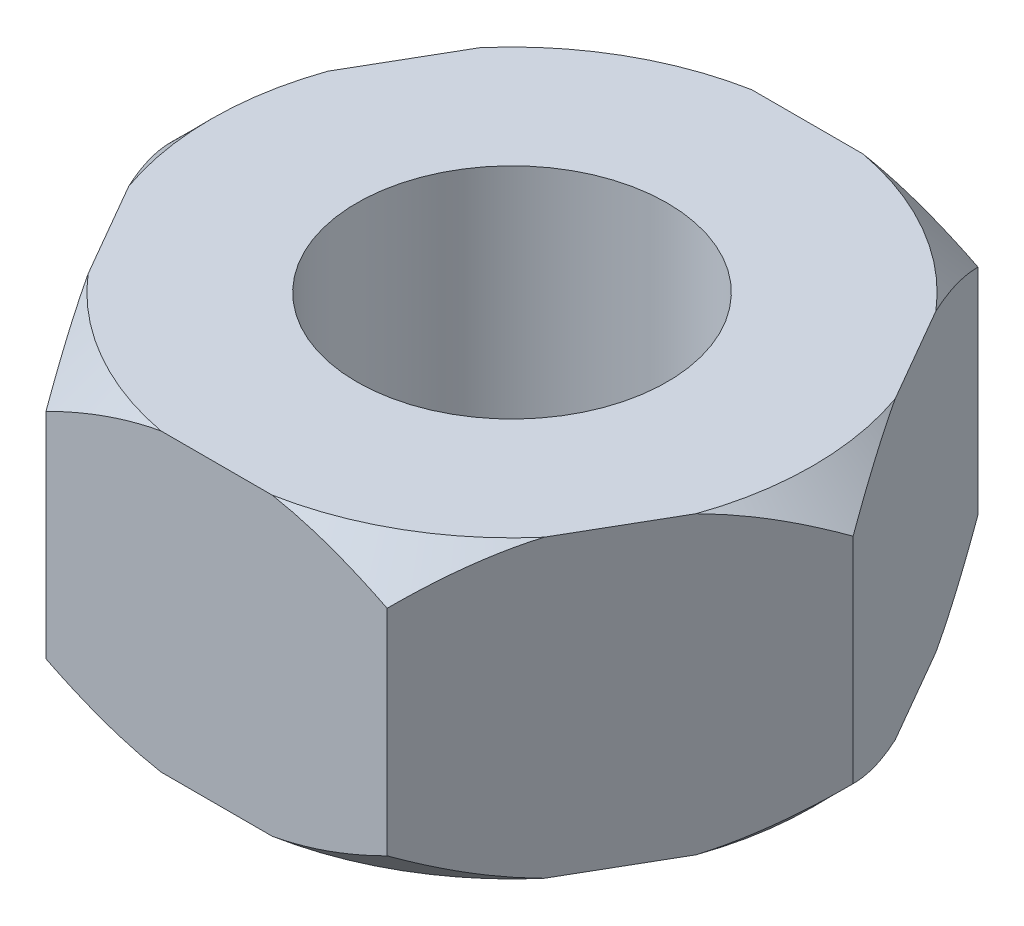
ISO-10303-21;
HEADER;
FILE_DESCRIPTION(('STEP AP214'),'2;1');
FILE_NAME('part.step','',(''),(''),'','','');
FILE_SCHEMA(('AUTOMOTIVE_DESIGN { 1 0 10303 214 1 1 1 1 }'));
ENDSEC;
DATA;
#1=APPLICATION_CONTEXT('core data for automotive mechanical design processes');
#2=APPLICATION_PROTOCOL_DEFINITION('international standard','automotive_design',2000,#1);
#3=PRODUCT_CONTEXT('',#1,'mechanical');
#4=PRODUCT('Part','Part','',(#3));
#5=PRODUCT_RELATED_PRODUCT_CATEGORY('part','',(#4));
#6=PRODUCT_DEFINITION_FORMATION('','',#4);
#7=PRODUCT_DEFINITION_CONTEXT('part definition',#1,'design');
#8=PRODUCT_DEFINITION('design','',#6,#7);
#9=PRODUCT_DEFINITION_SHAPE('','',#8);
#10=(LENGTH_UNIT() NAMED_UNIT(*) SI_UNIT(.MILLI.,.METRE.));
#11=(NAMED_UNIT(*) PLANE_ANGLE_UNIT() SI_UNIT($,.RADIAN.));
#12=(NAMED_UNIT(*) SI_UNIT($,.STERADIAN.) SOLID_ANGLE_UNIT());
#13=UNCERTAINTY_MEASURE_WITH_UNIT(LENGTH_MEASURE(1.E-05),#10,'distance_accuracy_value','');
#14=(GEOMETRIC_REPRESENTATION_CONTEXT(3) GLOBAL_UNCERTAINTY_ASSIGNED_CONTEXT((#13)) GLOBAL_UNIT_ASSIGNED_CONTEXT((#10,
#11,#12)) REPRESENTATION_CONTEXT('',''));
#15=CARTESIAN_POINT('',(0.,0.,0.));
#16=DIRECTION('',(0.,0.,1.));
#17=DIRECTION('',(1.,0.,0.));
#18=AXIS2_PLACEMENT_3D('',#15,#16,#17);
#19=CARTESIAN_POINT('',(-155.5659055475,-40.28,75.54261218576));
#20=DIRECTION('',(-0.866025403787037,0.,-0.4999999999955));
#21=DIRECTION('',(-0.4999999999955,0.,0.866025403787037));
#22=AXIS2_PLACEMENT_3D('',#19,#20,#21);
#23=PLANE('',#22);
#24=CARTESIAN_POINT('',(-157.921494645761,-36.7485356387702,79.6226121857378));
#25=CARTESIAN_POINT('',(-157.859691974781,-36.6867723869212,79.515566819565));
#26=CARTESIAN_POINT('',(-157.79712107854,-36.6278860064592,79.4071908482028));
#27=CARTESIAN_POINT('',(-157.670684653751,-36.5177944602112,79.1881965365405));
#28=CARTESIAN_POINT('',(-157.606826960013,-36.4665531121053,79.0775917665309));
#29=CARTESIAN_POINT('',(-157.477387724859,-36.372993690136,78.8533964347482));
#30=CARTESIAN_POINT('',(-157.411804456875,-36.33068496799,78.739802882472));
#31=CARTESIAN_POINT('',(-157.278814750935,-36.2567398375552,78.5094579548984));
#32=CARTESIAN_POINT('',(-157.211400928317,-36.2251569819203,78.3926937889897));
#33=CARTESIAN_POINT('',(-157.143314193647,-36.2000000000429,78.2747641052188));
#34=B_SPLINE_CURVE_WITH_KNOTS('',3,(#24,#25,#26,#27,#28,#29,#30,#31,#32,#33),.UNSPECIFIED.,.F.,
.F.,(4,2,2,2,4),(0.,0.414622566750982,0.827215920648911,1.2402391067894,1.65529513906042),.UNSPECIFIED.);
#35=CARTESIAN_POINT('',(-157.921494645754,-36.7485356387734,79.6226121857601));
#36=VERTEX_POINT('',#35);
#37=CARTESIAN_POINT('',(-157.143314193585,-36.20000000002,78.2747641051114));
#38=VERTEX_POINT('',#37);
#39=EDGE_CURVE('E152',#36,#38,#34,.T.);
#40=ORIENTED_EDGE('',*,*,#39,.T.);
#41=DIRECTION('',(0.4999999999955,0.,-0.866025403787037));
#42=VECTOR('',#41,1.);
#43=CARTESIAN_POINT('',(-156.7667941074,-36.2,77.62261218576));
#44=LINE('',#43,#42);
#45=CARTESIAN_POINT('',(-156.390274021262,-36.1999999999984,76.9704602664914));
#46=VERTEX_POINT('',#45);
#47=EDGE_CURVE('E145',#38,#46,#44,.T.);
#48=ORIENTED_EDGE('',*,*,#47,.T.);
#49=CARTESIAN_POINT('',(-156.390274021148,-36.2000000000406,76.9704602662901));
#50=CARTESIAN_POINT('',(-156.322187286478,-36.2251569819179,76.8525305825204));
#51=CARTESIAN_POINT('',(-156.254773463859,-36.2567398375526,76.7357664166124));
#52=CARTESIAN_POINT('',(-156.12178375792,-36.3306849679866,76.5054214890399));
#53=CARTESIAN_POINT('',(-156.056200489936,-36.3729936901321,76.3918279367641));
#54=CARTESIAN_POINT('',(-155.926761254783,-36.4665531121002,76.1676326049823));
#55=CARTESIAN_POINT('',(-155.862903561045,-36.5177944602055,76.0570278349732));
#56=CARTESIAN_POINT('',(-155.736467136257,-36.6278860064531,75.8380335233113));
#57=CARTESIAN_POINT('',(-155.673896240018,-36.6867723869155,75.7296575519488));
#58=CARTESIAN_POINT('',(-155.612093569043,-36.748535638766,75.6226121857749));
#59=B_SPLINE_CURVE_WITH_KNOTS('',3,(#49,#50,#51,#52,#53,#54,#55,#56,#57,#58),.UNSPECIFIED.,.F.,
.F.,(4,2,2,2,4),(0.,0.415056032269073,0.828079218407549,1.24067257230367,1.65529513905292),.UNSPECIFIED.);
#60=CARTESIAN_POINT('',(-155.612093569036,-36.7485356387688,75.6226121857677));
#61=VERTEX_POINT('',#60);
#62=EDGE_CURVE('E21',#46,#61,#59,.T.);
#63=ORIENTED_EDGE('',*,*,#62,.T.);
#64=DIRECTION('',(0.,1.,0.));
#65=VECTOR('',#64,1.);
#66=CARTESIAN_POINT('',(-155.612093569029,-38.2,75.62261218576));
#67=LINE('',#66,#65);
#68=CARTESIAN_POINT('',(-155.612093569028,-39.6514643612353,75.6226121857677));
#69=VERTEX_POINT('',#68);
#70=EDGE_CURVE('E232',#69,#61,#67,.T.);
#71=ORIENTED_EDGE('',*,*,#70,.F.);
#72=CARTESIAN_POINT('',(-155.612093569047,-39.6514643612363,75.6226121857725));
#73=CARTESIAN_POINT('',(-155.67389624002,-39.7132276130856,75.7296575519483));
#74=CARTESIAN_POINT('',(-155.736467136258,-39.7721139935474,75.8380335233115));
#75=CARTESIAN_POINT('',(-155.862903561045,-39.8822055397945,76.0570278349739));
#76=CARTESIAN_POINT('',(-155.926761254783,-39.9334468878998,76.1676326049827));
#77=CARTESIAN_POINT('',(-156.056200489937,-40.027006309868,76.3918279367642));
#78=CARTESIAN_POINT('',(-156.12178375792,-40.0693150320135,76.5054214890399));
#79=CARTESIAN_POINT('',(-156.254773463859,-40.1432601624474,76.7357664166126));
#80=CARTESIAN_POINT('',(-156.322187286477,-40.1748430180818,76.852530582521));
#81=CARTESIAN_POINT('',(-156.390274021146,-40.1999999999588,76.9704602662912));
#82=B_SPLINE_CURVE_WITH_KNOTS('',3,(#72,#73,#74,#75,#76,#77,#78,#79,#80,#81),.UNSPECIFIED.,.F.,
.F.,(4,2,2,2,4),(0.,0.414622566748969,0.827215920644832,1.24023910678314,1.6552951390521),.UNSPECIFIED.);
#83=CARTESIAN_POINT('',(-156.390274021206,-40.1999999999809,76.9704602663947));
#84=VERTEX_POINT('',#83);
#85=EDGE_CURVE('E171',#69,#84,#82,.T.);
#86=ORIENTED_EDGE('',*,*,#85,.T.);
#87=DIRECTION('',(-0.499999999995498,0.,0.866025403787038));
#88=VECTOR('',#87,1.);
#89=CARTESIAN_POINT('',(-156.7667941074,-40.2,77.62261218576));
#90=LINE('',#89,#88);
#91=CARTESIAN_POINT('',(-157.143314193527,-40.2000000000015,78.2747641050108));
#92=VERTEX_POINT('',#91);
#93=EDGE_CURVE('E172',#84,#92,#90,.T.);
#94=ORIENTED_EDGE('',*,*,#93,.T.);
#95=CARTESIAN_POINT('',(-157.143314193652,-40.1999999999591,78.2747641052172));
#96=CARTESIAN_POINT('',(-157.211400928319,-40.1748430180804,78.3926937889893));
#97=CARTESIAN_POINT('',(-157.278814750936,-40.1432601624449,78.5094579548987));
#98=CARTESIAN_POINT('',(-157.411804456875,-40.0693150320096,78.7398028824726));
#99=CARTESIAN_POINT('',(-157.477387724859,-40.0270063098637,78.8533964347487));
#100=CARTESIAN_POINT('',(-157.606826960014,-39.9334468878947,79.0775917665312));
#101=CARTESIAN_POINT('',(-157.670684653751,-39.8822055397889,79.1881965365407));
#102=CARTESIAN_POINT('',(-157.797121078539,-39.7721139935402,79.4071908482036));
#103=CARTESIAN_POINT('',(-157.859691974779,-39.7132276130772,79.5155668195664));
#104=CARTESIAN_POINT('',(-157.921494645755,-39.6514643612262,79.6226121857407));
#105=B_SPLINE_CURVE_WITH_KNOTS('',3,(#95,#96,#97,#98,#99,#100,#101,#102,#103,#104),
.UNSPECIFIED.,.F.,.F.,(4,2,2,2,4),(0.,0.415056032270949,0.828079218411311,1.24067257230941,
1.65529513906064),.UNSPECIFIED.);
#106=CARTESIAN_POINT('',(-157.92149464576,-39.6514643612208,79.6226121857499));
#107=VERTEX_POINT('',#106);
#108=EDGE_CURVE('E175',#92,#107,#105,.T.);
#109=ORIENTED_EDGE('',*,*,#108,.T.);
#110=DIRECTION('',(0.,-1.,0.));
#111=VECTOR('',#110,1.);
#112=CARTESIAN_POINT('',(-157.921494645766,-38.2,79.62261218576));
#113=LINE('',#112,#111);
#114=EDGE_CURVE('E434',#36,#107,#113,.T.);
#115=ORIENTED_EDGE('',*,*,#114,.F.);
#116=EDGE_LOOP('',(#40,#48,#63,#71,#86,#94,#109,#115));
#117=FACE_BOUND('',#116,.T.);
#118=ADVANCED_FACE('F17',(#117),#23,.T.);
#119=CARTESIAN_POINT('',(-157.9676826673,-40.28,79.54261218576));
#120=DIRECTION('',(-0.866025403787038,0.,0.499999999995498));
#121=DIRECTION('',(0.499999999995498,0.,0.866025403787038));
#122=AXIS2_PLACEMENT_3D('',#119,#120,#121);
#123=PLANE('',#122);
#124=CARTESIAN_POINT('',(-155.61209356904,-36.7485356387683,83.6226121857475));
#125=CARTESIAN_POINT('',(-155.673896240017,-36.6867723869172,83.5155668195737));
#126=CARTESIAN_POINT('',(-155.736467136256,-36.6278860064544,83.4071908482112));
#127=CARTESIAN_POINT('',(-155.862903561044,-36.5177944602064,83.1881965365488));
#128=CARTESIAN_POINT('',(-155.926761254782,-36.466553112101,83.0775917665394));
#129=CARTESIAN_POINT('',(-156.056200489936,-36.3729936901326,82.8533964347571));
#130=CARTESIAN_POINT('',(-156.12178375792,-36.3306849679869,82.7398028824811));
#131=CARTESIAN_POINT('',(-156.254773463859,-36.2567398375527,82.5094579549078));
#132=CARTESIAN_POINT('',(-156.322187286477,-36.2251569819181,82.3926937889992));
#133=CARTESIAN_POINT('',(-156.390274021147,-36.2000000000412,82.2747641052286));
#134=B_SPLINE_CURVE_WITH_KNOTS('',3,(#124,#125,#126,#127,#128,#129,#130,#131,#132,#133),
.UNSPECIFIED.,.F.,.F.,(4,2,2,2,4),(0.,0.414622566750397,0.82721592064761,1.24023910678717,
1.6552951390574),.UNSPECIFIED.);
#135=CARTESIAN_POINT('',(-155.612093569035,-36.7485356387698,83.6226121857541));
#136=VERTEX_POINT('',#135);
#137=CARTESIAN_POINT('',(-156.390274021206,-36.2000000000191,82.2747641051251));
#138=VERTEX_POINT('',#137);
#139=EDGE_CURVE('E429',#136,#138,#134,.T.);
#140=ORIENTED_EDGE('',*,*,#139,.T.);
#141=DIRECTION('',(-0.499999999995498,0.,-0.866025403787038));
#142=VECTOR('',#141,1.);
#143=CARTESIAN_POINT('',(-156.7667941074,-36.2,81.62261218576));
#144=LINE('',#143,#142);
#145=CARTESIAN_POINT('',(-157.143314193527,-36.1999999999984,80.9704602665093));
#146=VERTEX_POINT('',#145);
#147=EDGE_CURVE('E427',#138,#146,#144,.T.);
#148=ORIENTED_EDGE('',*,*,#147,.T.);
#149=CARTESIAN_POINT('',(-157.143314193652,-36.2000000000408,80.9704602663033));
#150=CARTESIAN_POINT('',(-157.211400928319,-36.2251569819194,80.852530582531));
#151=CARTESIAN_POINT('',(-157.278814750936,-36.2567398375549,80.7357664166217));
#152=CARTESIAN_POINT('',(-157.411804456875,-36.3306849679902,80.5054214890476));
#153=CARTESIAN_POINT('',(-157.477387724859,-36.3729936901362,80.3918279367715));
#154=CARTESIAN_POINT('',(-157.606826960014,-36.4665531121052,80.167632604989));
#155=CARTESIAN_POINT('',(-157.670684653751,-36.517794460211,80.0570278349794));
#156=CARTESIAN_POINT('',(-157.797121078539,-36.6278860064598,79.8380335233165));
#157=CARTESIAN_POINT('',(-157.859691974779,-36.6867723869227,79.7296575519536));
#158=CARTESIAN_POINT('',(-157.921494645755,-36.7485356387738,79.6226121857793));
#159=B_SPLINE_CURVE_WITH_KNOTS('',3,(#149,#150,#151,#152,#153,#154,#155,#156,#157,#158),
.UNSPECIFIED.,.F.,.F.,(4,2,2,2,4),(0.,0.415056032271064,0.828079218411548,1.24067257230975,
1.65529513906108),.UNSPECIFIED.);
#160=EDGE_CURVE('E156',#146,#36,#159,.T.);
#161=ORIENTED_EDGE('',*,*,#160,.T.);
#162=ORIENTED_EDGE('',*,*,#114,.T.);
#163=CARTESIAN_POINT('',(-157.921494645761,-39.65146436123,79.6226121857825));
#164=CARTESIAN_POINT('',(-157.859691974781,-39.713227613079,79.7296575519553));
#165=CARTESIAN_POINT('',(-157.79712107854,-39.772113993541,79.8380335233175));
#166=CARTESIAN_POINT('',(-157.67068465375,-39.8822055397889,80.0570278349798));
#167=CARTESIAN_POINT('',(-157.606826960013,-39.9334468878949,80.1676326049894));
#168=CARTESIAN_POINT('',(-157.477387724859,-40.0270063098641,80.3918279367721));
#169=CARTESIAN_POINT('',(-157.411804456875,-40.0693150320102,80.5054214890483));
#170=CARTESIAN_POINT('',(-157.278814750935,-40.1432601624449,80.7357664166219));
#171=CARTESIAN_POINT('',(-157.211400928317,-40.1748430180798,80.8525305825307));
#172=CARTESIAN_POINT('',(-157.143314193647,-40.1999999999572,80.9704602663016));
#173=B_SPLINE_CURVE_WITH_KNOTS('',3,(#163,#164,#165,#166,#167,#168,#169,#170,#171,#172),
.UNSPECIFIED.,.F.,.F.,(4,2,2,2,4),(0.,0.414622566751001,0.827215920648933,1.24023910678942,
1.65529513906044),.UNSPECIFIED.);
#174=CARTESIAN_POINT('',(-157.143314193585,-40.1999999999801,80.9704602664087));
#175=VERTEX_POINT('',#174);
#176=EDGE_CURVE('E433',#107,#175,#173,.T.);
#177=ORIENTED_EDGE('',*,*,#176,.T.);
#178=DIRECTION('',(0.499999999995498,0.,0.866025403787038));
#179=VECTOR('',#178,1.);
#180=CARTESIAN_POINT('',(-156.7667941074,-40.2,81.62261218576));
#181=LINE('',#180,#179);
#182=CARTESIAN_POINT('',(-156.390274021262,-40.2000000000015,82.2747641050287));
#183=VERTEX_POINT('',#182);
#184=EDGE_CURVE('E430',#175,#183,#181,.T.);
#185=ORIENTED_EDGE('',*,*,#184,.T.);
#186=CARTESIAN_POINT('',(-156.390274021148,-40.1999999999595,82.2747641052297));
#187=CARTESIAN_POINT('',(-156.322187286478,-40.1748430180822,82.3926937889994));
#188=CARTESIAN_POINT('',(-156.254773463859,-40.1432601624475,82.5094579549075));
#189=CARTESIAN_POINT('',(-156.12178375792,-40.0693150320134,82.73980288248));
#190=CARTESIAN_POINT('',(-156.056200489936,-40.0270063098679,82.8533964347559));
#191=CARTESIAN_POINT('',(-155.926761254783,-39.9334468878998,83.0775917665377));
#192=CARTESIAN_POINT('',(-155.862903561045,-39.8822055397946,83.1881965365467));
#193=CARTESIAN_POINT('',(-155.736467136257,-39.7721139935469,83.4071908482087));
#194=CARTESIAN_POINT('',(-155.673896240018,-39.7132276130845,83.5155668195711));
#195=CARTESIAN_POINT('',(-155.612093569043,-39.6514643612339,83.6226121857451));
#196=B_SPLINE_CURVE_WITH_KNOTS('',3,(#186,#187,#188,#189,#190,#191,#192,#193,#194,#195),
.UNSPECIFIED.,.F.,.F.,(4,2,2,2,4),(0.,0.415056032269142,0.828079218407667,1.24067257230384,
1.65529513905314),.UNSPECIFIED.);
#197=CARTESIAN_POINT('',(-155.612093569036,-39.6514643612312,83.6226121857523));
#198=VERTEX_POINT('',#197);
#199=EDGE_CURVE('E432',#183,#198,#196,.T.);
#200=ORIENTED_EDGE('',*,*,#199,.T.);
#201=DIRECTION('',(0.,-1.,0.));
#202=VECTOR('',#201,1.);
#203=CARTESIAN_POINT('',(-155.612093569029,-38.2,83.62261218576));
#204=LINE('',#203,#202);
#205=EDGE_CURVE('E421',#136,#198,#204,.T.);
#206=ORIENTED_EDGE('',*,*,#205,.F.);
#207=EDGE_LOOP('',(#140,#148,#161,#162,#177,#185,#200,#206));
#208=FACE_BOUND('',#207,.T.);
#209=ADVANCED_FACE('F194',(#208),#123,.T.);
#210=CARTESIAN_POINT('',(-150.9009153724,-40.28,75.62261218576));
#211=DIRECTION('',(0.,0.,-1.));
#212=DIRECTION('',(-1.,0.,0.));
#213=AXIS2_PLACEMENT_3D('',#210,#211,#212);
#214=PLANE('',#213);
#215=CARTESIAN_POINT('',(-155.612093569014,-36.7485356387613,75.6226121857543));
#216=CARTESIAN_POINT('',(-155.488488227059,-36.6867723869088,75.6226121857579));
#217=CARTESIAN_POINT('',(-155.363346434578,-36.6278860064436,75.6226121857594));
#218=CARTESIAN_POINT('',(-155.110473584996,-36.5177944601895,75.6226121857605));
#219=CARTESIAN_POINT('',(-154.982758197517,-36.4665531120806,75.6226121857601));
#220=CARTESIAN_POINT('',(-154.723879727203,-36.3729936901056,75.6226121857598));
#221=CARTESIAN_POINT('',(-154.592713191231,-36.3306849679567,75.6226121857599));
#222=CARTESIAN_POINT('',(-154.326733779345,-36.2567398375164,75.6226121857601));
#223=CARTESIAN_POINT('',(-154.191906134105,-36.2251569818789,75.6226121857601));
#224=CARTESIAN_POINT('',(-154.055732664762,-36.1999999999991,75.62261218576));
#225=B_SPLINE_CURVE_WITH_KNOTS('',3,(#215,#216,#217,#218,#219,#220,#221,#222,#223,#224),
.UNSPECIFIED.,.F.,.F.,(4,2,2,2,4),(0.,0.414622566759554,0.827215920665987,1.24023910681503,
1.65529513909453),.UNSPECIFIED.);
#226=CARTESIAN_POINT('',(-154.055732664756,-36.199999999998,75.62261218576));
#227=VERTEX_POINT('',#226);
#228=EDGE_CURVE('E170',#61,#227,#225,.T.);
#229=ORIENTED_EDGE('',*,*,#228,.T.);
#230=DIRECTION('',(1.,0.,0.));
#231=VECTOR('',#230,1.);
#232=CARTESIAN_POINT('',(-153.30269249225,-36.2,75.62261218576));
#233=LINE('',#232,#231);
#234=CARTESIAN_POINT('',(-152.549652319642,-36.1999999999984,75.62261218576));
#235=VERTEX_POINT('',#234);
#236=EDGE_CURVE('E163',#227,#235,#233,.T.);
#237=ORIENTED_EDGE('',*,*,#236,.T.);
#238=CARTESIAN_POINT('',(-152.549652319716,-36.1999999999848,75.62261218576));
#239=CARTESIAN_POINT('',(-152.413478850373,-36.2251569818619,75.62261218576));
#240=CARTESIAN_POINT('',(-152.278651205133,-36.256739837497,75.62261218576));
#241=CARTESIAN_POINT('',(-152.012671793247,-36.3306849679327,75.62261218576));
#242=CARTESIAN_POINT('',(-151.881505257275,-36.3729936900795,75.62261218576));
#243=CARTESIAN_POINT('',(-151.622626786961,-36.4665531120505,75.62261218576));
#244=CARTESIAN_POINT('',(-151.494911399482,-36.5177944601573,75.62261218576));
#245=CARTESIAN_POINT('',(-151.2420385499,-36.6278860064084,75.62261218576));
#246=CARTESIAN_POINT('',(-151.116896757418,-36.6867723868727,75.62261218576));
#247=CARTESIAN_POINT('',(-150.993291415464,-36.7485356387253,75.62261218576));
#248=B_SPLINE_CURVE_WITH_KNOTS('',3,(#238,#239,#240,#241,#242,#243,#244,#245,#246,#247),
.UNSPECIFIED.,.F.,.F.,(4,2,2,2,4),(0.,0.415056032277929,0.828079218425136,1.24067257232983,
1.65529513908789),.UNSPECIFIED.);
#249=CARTESIAN_POINT('',(-150.993291415465,-36.748535638725,75.6226121857599));
#250=VERTEX_POINT('',#249);
#251=EDGE_CURVE('E261',#235,#250,#248,.T.);
#252=ORIENTED_EDGE('',*,*,#251,.T.);
#253=DIRECTION('',(0.,1.,0.));
#254=VECTOR('',#253,1.);
#255=CARTESIAN_POINT('',(-150.993291415466,-38.2,75.6226121857597));
#256=LINE('',#255,#254);
#257=CARTESIAN_POINT('',(-150.993291415467,-39.6514643612752,75.6226121857592));
#258=VERTEX_POINT('',#257);
#259=EDGE_CURVE('E281',#258,#250,#256,.T.);
#260=ORIENTED_EDGE('',*,*,#259,.F.);
#261=CARTESIAN_POINT('',(-150.993291415467,-39.6514643612759,75.62261218576));
#262=CARTESIAN_POINT('',(-151.11689675742,-39.7132276131284,75.62261218576));
#263=CARTESIAN_POINT('',(-151.242038549902,-39.7721139935925,75.62261218576));
#264=CARTESIAN_POINT('',(-151.494911399483,-39.8822055398434,75.62261218576));
#265=CARTESIAN_POINT('',(-151.622626786962,-39.9334468879501,75.62261218576));
#266=CARTESIAN_POINT('',(-151.881505257277,-40.0270063099208,75.62261218576));
#267=CARTESIAN_POINT('',(-152.012671793248,-40.0693150320675,75.62261218576));
#268=CARTESIAN_POINT('',(-152.278651205133,-40.1432601625031,75.62261218576));
#269=CARTESIAN_POINT('',(-152.413478850373,-40.1748430181382,75.62261218576));
#270=CARTESIAN_POINT('',(-152.549652319716,-40.2000000000153,75.62261218576));
#271=B_SPLINE_CURVE_WITH_KNOTS('',3,(#261,#262,#263,#264,#265,#266,#267,#268,#269,#270),
.UNSPECIFIED.,.F.,.F.,(4,2,2,2,4),(0.,0.414622566757387,0.827215920661415,1.24023910680793,
1.65529513908515),.UNSPECIFIED.);
#272=CARTESIAN_POINT('',(-152.549652319683,-40.2000000000092,75.62261218576));
#273=VERTEX_POINT('',#272);
#274=EDGE_CURVE('E256',#258,#273,#271,.T.);
#275=ORIENTED_EDGE('',*,*,#274,.T.);
#276=DIRECTION('',(-1.,0.,0.));
#277=VECTOR('',#276,1.);
#278=CARTESIAN_POINT('',(-153.30269249225,-40.2,75.62261218576));
#279=LINE('',#278,#277);
#280=CARTESIAN_POINT('',(-154.055732664758,-40.2000000000015,75.62261218576));
#281=VERTEX_POINT('',#280);
#282=EDGE_CURVE('E260',#273,#281,#279,.T.);
#283=ORIENTED_EDGE('',*,*,#282,.T.);
#284=CARTESIAN_POINT('',(-154.055732664762,-40.2000000000009,75.62261218576));
#285=CARTESIAN_POINT('',(-154.191906134105,-40.1748430181213,75.62261218576));
#286=CARTESIAN_POINT('',(-154.326733779345,-40.1432601624837,75.62261218576));
#287=CARTESIAN_POINT('',(-154.592713191231,-40.0693150320433,75.62261218576));
#288=CARTESIAN_POINT('',(-154.723879727202,-40.0270063098944,75.62261218576));
#289=CARTESIAN_POINT('',(-154.982758197517,-39.9334468879194,75.62261218576));
#290=CARTESIAN_POINT('',(-155.110473584996,-39.8822055398106,75.62261218576));
#291=CARTESIAN_POINT('',(-155.363346434578,-39.772113993556,75.62261218576));
#292=CARTESIAN_POINT('',(-155.488488227059,-39.7132276130901,75.62261218576));
#293=CARTESIAN_POINT('',(-155.612093569013,-39.6514643612359,75.62261218576));
#294=B_SPLINE_CURVE_WITH_KNOTS('',3,(#284,#285,#286,#287,#288,#289,#290,#291,#292,#293),
.UNSPECIFIED.,.F.,.F.,(4,2,2,2,4),(0.,0.415056032279846,0.828079218429034,1.24067257233574,
1.65529513909573),.UNSPECIFIED.);
#295=EDGE_CURVE('E240',#281,#69,#294,.T.);
#296=ORIENTED_EDGE('',*,*,#295,.T.);
#297=ORIENTED_EDGE('',*,*,#70,.T.);
#298=EDGE_LOOP('',(#229,#237,#252,#260,#275,#283,#296,#297));
#299=FACE_BOUND('',#298,.T.);
#300=ADVANCED_FACE('F245',(#299),#214,.T.);
#301=CARTESIAN_POINT('',(-155.7044696121,-40.28,83.62261218576));
#302=DIRECTION('',(0.,0.,1.));
#303=DIRECTION('',(1.,0.,0.));
#304=AXIS2_PLACEMENT_3D('',#301,#302,#303);
#305=PLANE('',#304);
#306=CARTESIAN_POINT('',(-150.993291415463,-36.7485356387259,83.62261218576));
#307=CARTESIAN_POINT('',(-151.116896757416,-36.6867723868735,83.62261218576));
#308=CARTESIAN_POINT('',(-151.242038549897,-36.6278860064095,83.62261218576));
#309=CARTESIAN_POINT('',(-151.494911399478,-36.5177944601587,83.62261218576));
#310=CARTESIAN_POINT('',(-151.622626786956,-36.4665531120521,83.62261218576));
#311=CARTESIAN_POINT('',(-151.88150525727,-36.3729936900814,83.62261218576));
#312=CARTESIAN_POINT('',(-152.012671793241,-36.3306849679347,83.62261218576));
#313=CARTESIAN_POINT('',(-152.278651205125,-36.2567398374988,83.62261218576));
#314=CARTESIAN_POINT('',(-152.413478850365,-36.2251569818637,83.62261218576));
#315=CARTESIAN_POINT('',(-152.549652319707,-36.1999999999864,83.62261218576));
#316=B_SPLINE_CURVE_WITH_KNOTS('',3,(#306,#307,#308,#309,#310,#311,#312,#313,#314,#315),
.UNSPECIFIED.,.F.,.F.,(4,2,2,2,4),(0.,0.414622566756066,0.827215920658808,1.24023910680401,
1.65529513907994),.UNSPECIFIED.);
#317=CARTESIAN_POINT('',(-150.993291415463,-36.7485356387248,83.6226121857592));
#318=VERTEX_POINT('',#317);
#319=CARTESIAN_POINT('',(-152.54965231967,-36.1999999999932,83.62261218576));
#320=VERTEX_POINT('',#319);
#321=EDGE_CURVE('E314',#318,#320,#316,.T.);
#322=ORIENTED_EDGE('',*,*,#321,.T.);
#323=DIRECTION('',(-1.,0.,0.));
#324=VECTOR('',#323,1.);
#325=CARTESIAN_POINT('',(-153.30269249225,-36.2,83.62261218576));
#326=LINE('',#325,#324);
#327=CARTESIAN_POINT('',(-154.055732664758,-36.1999999999984,83.62261218576));
#328=VERTEX_POINT('',#327);
#329=EDGE_CURVE('E364',#320,#328,#326,.T.);
#330=ORIENTED_EDGE('',*,*,#329,.T.);
#331=CARTESIAN_POINT('',(-154.055732664752,-36.1999999999972,83.62261218576));
#332=CARTESIAN_POINT('',(-154.191906134094,-36.2251569818765,83.62261218576));
#333=CARTESIAN_POINT('',(-154.326733779335,-36.2567398375137,83.62261218576));
#334=CARTESIAN_POINT('',(-154.59271319122,-36.3306849679533,83.62261218576));
#335=CARTESIAN_POINT('',(-154.723879727191,-36.3729936901019,83.62261218576));
#336=CARTESIAN_POINT('',(-154.982758197506,-36.4665531120761,83.62261218576));
#337=CARTESIAN_POINT('',(-155.110473584984,-36.5177944601845,83.62261218576));
#338=CARTESIAN_POINT('',(-155.363346434566,-36.6278860064384,83.62261218576));
#339=CARTESIAN_POINT('',(-155.488488227047,-36.6867723869041,83.62261218576));
#340=CARTESIAN_POINT('',(-155.612093569001,-36.7485356387579,83.62261218576));
#341=B_SPLINE_CURVE_WITH_KNOTS('',3,(#331,#332,#333,#334,#335,#336,#337,#338,#339,#340),
.UNSPECIFIED.,.F.,.F.,(4,2,2,2,4),(0.,0.415056032278941,0.82807921842715,1.24067257233291,
1.65529513909197),.UNSPECIFIED.);
#342=EDGE_CURVE('E308',#328,#136,#341,.T.);
#343=ORIENTED_EDGE('',*,*,#342,.T.);
#344=ORIENTED_EDGE('',*,*,#205,.T.);
#345=CARTESIAN_POINT('',(-155.612093569014,-39.651464361239,83.6226121857658));
#346=CARTESIAN_POINT('',(-155.488488227059,-39.7132276130913,83.6226121857621));
#347=CARTESIAN_POINT('',(-155.363346434578,-39.7721139935565,83.6226121857605));
#348=CARTESIAN_POINT('',(-155.110473584996,-39.8822055398105,83.6226121857594));
#349=CARTESIAN_POINT('',(-154.982758197517,-39.9334468879194,83.6226121857598));
#350=CARTESIAN_POINT('',(-154.723879727203,-40.0270063098944,83.6226121857602));
#351=CARTESIAN_POINT('',(-154.592713191231,-40.0693150320433,83.6226121857601));
#352=CARTESIAN_POINT('',(-154.326733779345,-40.1432601624836,83.6226121857599));
#353=CARTESIAN_POINT('',(-154.191906134105,-40.1748430181211,83.6226121857598));
#354=CARTESIAN_POINT('',(-154.055732664762,-40.2000000000008,83.62261218576));
#355=B_SPLINE_CURVE_WITH_KNOTS('',3,(#345,#346,#347,#348,#349,#350,#351,#352,#353,#354),
.UNSPECIFIED.,.F.,.F.,(4,2,2,2,4),(0.,0.414622566759535,0.827215920665909,1.2402391068149,
1.65529513909441),.UNSPECIFIED.);
#356=CARTESIAN_POINT('',(-154.055732664756,-40.2000000000019,83.62261218576));
#357=VERTEX_POINT('',#356);
#358=EDGE_CURVE('E233',#198,#357,#355,.T.);
#359=ORIENTED_EDGE('',*,*,#358,.T.);
#360=DIRECTION('',(1.,0.,0.));
#361=VECTOR('',#360,1.);
#362=CARTESIAN_POINT('',(-153.30269249225,-40.2,83.62261218576));
#363=LINE('',#362,#361);
#364=CARTESIAN_POINT('',(-152.549652319642,-40.2000000000015,83.62261218576));
#365=VERTEX_POINT('',#364);
#366=EDGE_CURVE('E354',#357,#365,#363,.T.);
#367=ORIENTED_EDGE('',*,*,#366,.T.);
#368=CARTESIAN_POINT('',(-152.549652319716,-40.2000000000151,83.62261218576));
#369=CARTESIAN_POINT('',(-152.413478850373,-40.174843018138,83.62261218576));
#370=CARTESIAN_POINT('',(-152.278651205132,-40.1432601625029,83.62261218576));
#371=CARTESIAN_POINT('',(-152.012671793247,-40.0693150320672,83.62261218576));
#372=CARTESIAN_POINT('',(-151.881505257275,-40.0270063099204,83.62261218576));
#373=CARTESIAN_POINT('',(-151.62262678696,-39.9334468879495,83.62261218576));
#374=CARTESIAN_POINT('',(-151.494911399482,-39.8822055398427,83.62261218576));
#375=CARTESIAN_POINT('',(-151.242038549899,-39.7721139935915,83.62261218576));
#376=CARTESIAN_POINT('',(-151.116896757418,-39.7132276131272,83.62261218576));
#377=CARTESIAN_POINT('',(-150.993291415464,-39.6514643612746,83.62261218576));
#378=B_SPLINE_CURVE_WITH_KNOTS('',3,(#368,#369,#370,#371,#372,#373,#374,#375,#376,#377),
.UNSPECIFIED.,.F.,.F.,(4,2,2,2,4),(0.,0.415056032277822,0.82807921842486,1.24067257232948,
1.65529513908744),.UNSPECIFIED.);
#379=CARTESIAN_POINT('',(-150.993291415465,-39.651464361275,83.62261218576));
#380=VERTEX_POINT('',#379);
#381=EDGE_CURVE('E359',#365,#380,#378,.T.);
#382=ORIENTED_EDGE('',*,*,#381,.T.);
#383=DIRECTION('',(0.,-1.,0.));
#384=VECTOR('',#383,1.);
#385=CARTESIAN_POINT('',(-150.993291415466,-38.2,83.62261218576));
#386=LINE('',#385,#384);
#387=EDGE_CURVE('E412',#318,#380,#386,.T.);
#388=ORIENTED_EDGE('',*,*,#387,.F.);
#389=EDGE_LOOP('',(#322,#330,#343,#344,#359,#367,#382,#388));
#390=FACE_BOUND('',#389,.T.);
#391=ADVANCED_FACE('F248',(#390),#305,.T.);
#392=CARTESIAN_POINT('',(-148.6377023172,-40.28,79.70261218576));
#393=DIRECTION('',(0.866025403787042,0.,-0.499999999995491));
#394=DIRECTION('',(-0.499999999995491,0.,-0.866025403787042));
#395=AXIS2_PLACEMENT_3D('',#392,#393,#394);
#396=PLANE('',#395);
#397=CARTESIAN_POINT('',(-150.993291415465,-36.7485356387241,75.6226121857609));
#398=CARTESIAN_POINT('',(-150.931488744489,-36.6867723868707,75.7296575519357));
#399=CARTESIAN_POINT('',(-150.86891784825,-36.6278860064055,75.838033523299));
#400=CARTESIAN_POINT('',(-150.742481423461,-36.5177944601521,76.0570278349628));
#401=CARTESIAN_POINT('',(-150.678623729723,-36.466553112044,76.1676326049728));
#402=CARTESIAN_POINT('',(-150.549184494568,-36.3729936900701,76.3918279367567));
#403=CARTESIAN_POINT('',(-150.483601226583,-36.3306849679217,76.5054214890336));
#404=CARTESIAN_POINT('',(-150.350611520643,-36.2567398374821,76.7357664166088));
#405=CARTESIAN_POINT('',(-150.283197698024,-36.225156981845,76.8525305825185));
#406=CARTESIAN_POINT('',(-150.215110963354,-36.1999999999655,76.9704602662903));
#407=B_SPLINE_CURVE_WITH_KNOTS('',3,(#397,#398,#399,#400,#401,#402,#403,#404,#405,#406),
.UNSPECIFIED.,.F.,.F.,(4,2,2,2,4),(0.,0.414622566755648,0.827215920658099,1.24023910680298,
1.6552951390785),.UNSPECIFIED.);
#408=CARTESIAN_POINT('',(-150.215110963401,-36.1999999999828,76.9704602662098));
#409=VERTEX_POINT('',#408);
#410=EDGE_CURVE('E302',#250,#409,#407,.T.);
#411=ORIENTED_EDGE('',*,*,#410,.T.);
#412=DIRECTION('',(0.499999999995491,0.,0.866025403787042));
#413=VECTOR('',#412,1.);
#414=CARTESIAN_POINT('',(-149.8385908771,-36.2,77.62261218576));
#415=LINE('',#414,#413);
#416=CARTESIAN_POINT('',(-149.462070790775,-36.1999999999772,78.2747641053526));
#417=VERTEX_POINT('',#416);
#418=EDGE_CURVE('E416',#409,#417,#415,.T.);
#419=ORIENTED_EDGE('',*,*,#418,.T.);
#420=CARTESIAN_POINT('',(-149.462070790837,-36.1999999999542,78.2747641052456));
#421=CARTESIAN_POINT('',(-149.393984056167,-36.2251569818317,78.3926937890174));
#422=CARTESIAN_POINT('',(-149.326570233548,-36.256739837467,78.5094579549272));
#423=CARTESIAN_POINT('',(-149.193580527607,-36.330684967903,78.7398028825026));
#424=CARTESIAN_POINT('',(-149.127997259623,-36.3729936900498,78.8533964347796));
#425=CARTESIAN_POINT('',(-148.998558024468,-36.4665531120206,79.0775917665637));
#426=CARTESIAN_POINT('',(-148.934700330729,-36.5177944601273,79.1881965365739));
#427=CARTESIAN_POINT('',(-148.808263905941,-36.6278860063781,79.407190848238));
#428=CARTESIAN_POINT('',(-148.745693009701,-36.6867723868421,79.5155668196015));
#429=CARTESIAN_POINT('',(-148.683890338725,-36.7485356386944,79.6226121857765));
#430=B_SPLINE_CURVE_WITH_KNOTS('',3,(#420,#421,#422,#423,#424,#425,#426,#427,#428,#429),
.UNSPECIFIED.,.F.,.F.,(4,2,2,2,4),(0.,0.415056032274488,0.828079218418218,1.24067257231954,
1.65529513907416),.UNSPECIFIED.);
#431=CARTESIAN_POINT('',(-148.68389033873,-36.7485356386899,79.6226121857683));
#432=VERTEX_POINT('',#431);
#433=EDGE_CURVE('E283',#417,#432,#430,.T.);
#434=ORIENTED_EDGE('',*,*,#433,.T.);
#435=DIRECTION('',(0.,1.,0.));
#436=VECTOR('',#435,1.);
#437=CARTESIAN_POINT('',(-148.683890338734,-38.2,79.6226121857597));
#438=LINE('',#437,#436);
#439=CARTESIAN_POINT('',(-148.68389033873,-39.6514643613102,79.6226121857682));
#440=VERTEX_POINT('',#439);
#441=EDGE_CURVE('E406',#440,#432,#438,.T.);
#442=ORIENTED_EDGE('',*,*,#441,.F.);
#443=CARTESIAN_POINT('',(-148.683890338728,-39.6514643613037,79.6226121857779));
#444=CARTESIAN_POINT('',(-148.745693009702,-39.7132276131573,79.5155668196019));
#445=CARTESIAN_POINT('',(-148.808263905941,-39.7721139936219,79.4071908482378));
#446=CARTESIAN_POINT('',(-148.93470033073,-39.8822055398733,79.1881965365728));
#447=CARTESIAN_POINT('',(-148.998558024468,-39.93344688798,79.0775917665624));
#448=CARTESIAN_POINT('',(-149.127997259624,-40.0270063099509,78.8533964347778));
#449=CARTESIAN_POINT('',(-149.193580527609,-40.0693150320977,78.7398028825005));
#450=CARTESIAN_POINT('',(-149.326570233549,-40.1432601625338,78.5094579549244));
#451=CARTESIAN_POINT('',(-149.393984056168,-40.1748430181691,78.3926937890143));
#452=CARTESIAN_POINT('',(-149.462070790839,-40.2000000000465,78.2747641052422));
#453=B_SPLINE_CURVE_WITH_KNOTS('',3,(#443,#444,#445,#446,#447,#448,#449,#450,#451,#452),
.UNSPECIFIED.,.F.,.F.,(4,2,2,2,4),(0.,0.4146225667558,0.82721592065823,1.240239106803,
1.65529513907864),.UNSPECIFIED.);
#454=CARTESIAN_POINT('',(-149.46207079078,-40.2000000000248,78.2747641053436));
#455=VERTEX_POINT('',#454);
#456=EDGE_CURVE('E288',#440,#455,#453,.T.);
#457=ORIENTED_EDGE('',*,*,#456,.T.);
#458=DIRECTION('',(-0.499999999995485,0.,-0.866025403787045));
#459=VECTOR('',#458,1.);
#460=CARTESIAN_POINT('',(-149.8385908771,-40.2,77.62261218576));
#461=LINE('',#460,#459);
#462=CARTESIAN_POINT('',(-150.215110963442,-40.2000000000015,76.9704602661364));
#463=VERTEX_POINT('',#462);
#464=EDGE_CURVE('E282',#455,#463,#461,.T.);
#465=ORIENTED_EDGE('',*,*,#464,.T.);
#466=CARTESIAN_POINT('',(-150.215110963357,-40.200000000033,76.9704602662888));
#467=CARTESIAN_POINT('',(-150.283197698026,-40.1748430181541,76.8525305825162));
#468=CARTESIAN_POINT('',(-150.350611520645,-40.143260162517,76.7357664166062));
#469=CARTESIAN_POINT('',(-150.483601226585,-40.0693150320775,76.5054214890308));
#470=CARTESIAN_POINT('',(-150.549184494569,-40.0270063099289,76.391827936754));
#471=CARTESIAN_POINT('',(-150.678623729724,-39.9334468879548,76.1676326049703));
#472=CARTESIAN_POINT('',(-150.742481423462,-39.8822055398466,76.0570278349602));
#473=CARTESIAN_POINT('',(-150.868917848251,-39.7721139935932,75.8380335232964));
#474=CARTESIAN_POINT('',(-150.931488744491,-39.7132276131279,75.7296575519331));
#475=CARTESIAN_POINT('',(-150.993291415467,-39.6514643612744,75.6226121857584));
#476=B_SPLINE_CURVE_WITH_KNOTS('',3,(#466,#467,#468,#469,#470,#471,#472,#473,#474,#475),
.UNSPECIFIED.,.F.,.F.,(4,2,2,2,4),(0.,0.415056032275646,0.828079218420569,1.24067257232302,
1.65529513907869),.UNSPECIFIED.);
#477=EDGE_CURVE('E275',#463,#258,#476,.T.);
#478=ORIENTED_EDGE('',*,*,#477,.T.);
#479=ORIENTED_EDGE('',*,*,#259,.T.);
#480=EDGE_LOOP('',(#411,#419,#434,#442,#457,#465,#478,#479));
#481=FACE_BOUND('',#480,.T.);
#482=ADVANCED_FACE('F292',(#481),#396,.T.);
#483=CARTESIAN_POINT('',(-153.3026924922,-36.7518268525554,79.62261218576));
#484=DIRECTION('',(0.,-1.,0.));
#485=DIRECTION('',(0.,0.,-1.));
#486=AXIS2_PLACEMENT_3D('',#483,#484,#485);
#487=CONICAL_SURFACE('',#486,4.62209336733574,0.785398163379964);
#488=CARTESIAN_POINT('',(-148.683890338728,-36.7485356386964,79.6226121857417));
#489=CARTESIAN_POINT('',(-148.745693009702,-36.6867723868429,79.7296575519177));
#490=CARTESIAN_POINT('',(-148.808263905941,-36.6278860063783,79.8380335232817));
#491=CARTESIAN_POINT('',(-148.934700330729,-36.517794460127,80.0570278349465));
#492=CARTESIAN_POINT('',(-148.998558024468,-36.4665531120203,80.1676326049569));
#493=CARTESIAN_POINT('',(-149.127997259623,-36.3729936900494,80.3918279367414));
#494=CARTESIAN_POINT('',(-149.193580527608,-36.3306849679025,80.5054214890186));
#495=CARTESIAN_POINT('',(-149.326570233549,-36.2567398374664,80.7357664165946));
#496=CARTESIAN_POINT('',(-149.393984056168,-36.2251569818311,80.8525305825046));
#497=CARTESIAN_POINT('',(-149.462070790838,-36.1999999999538,80.9704602662767));
#498=B_SPLINE_CURVE_WITH_KNOTS('',3,(#488,#489,#490,#491,#492,#493,#494,#495,#496,#497),
.UNSPECIFIED.,.F.,.F.,(4,2,2,2,4),(0.,0.414622566755532,0.827215920657742,1.24023910680228,
1.65529513907767),.UNSPECIFIED.);
#499=CARTESIAN_POINT('',(-149.462070790791,-36.1999999999753,80.9704602662061));
#500=VERTEX_POINT('',#499);
#501=EDGE_CURVE('E402',#432,#500,#498,.T.);
#502=ORIENTED_EDGE('',*,*,#501,.F.);
#503=ORIENTED_EDGE('',*,*,#433,.F.);
#504=CARTESIAN_POINT('',(-153.3026924922,-36.1999999999969,79.62261218576));
#505=DIRECTION('',(0.,-1.,0.));
#506=DIRECTION('',(0.,0.,-1.));
#507=AXIS2_PLACEMENT_3D('',#504,#505,#506);
#508=CIRCLE('',#507,4.07026651479655);
#509=EDGE_CURVE('E400',#500,#417,#508,.F.);
#510=ORIENTED_EDGE('',*,*,#509,.F.);
#511=EDGE_LOOP('',(#502,#503,#510));
#512=FACE_BOUND('',#511,.T.);
#513=ADVANCED_FACE('F195',(#512),#487,.T.);
#514=CARTESIAN_POINT('',(-153.3026924922,-36.7518268525554,79.62261218576));
#515=DIRECTION('',(0.,-1.,0.));
#516=DIRECTION('',(0.,0.,-1.));
#517=AXIS2_PLACEMENT_3D('',#514,#515,#516);
#518=CONICAL_SURFACE('',#517,4.62209336733574,0.785398163379964);
#519=ORIENTED_EDGE('',*,*,#251,.F.);
#520=CARTESIAN_POINT('',(-153.3026924922,-36.1999999999969,79.62261218576));
#521=DIRECTION('',(0.,-1.,0.));
#522=DIRECTION('',(0.,0.,-1.));
#523=AXIS2_PLACEMENT_3D('',#520,#521,#522);
#524=CIRCLE('',#523,4.07026651479655);
#525=EDGE_CURVE('E167',#409,#235,#524,.F.);
#526=ORIENTED_EDGE('',*,*,#525,.F.);
#527=ORIENTED_EDGE('',*,*,#410,.F.);
#528=EDGE_LOOP('',(#519,#526,#527));
#529=FACE_BOUND('',#528,.T.);
#530=ADVANCED_FACE('F223',(#529),#518,.T.);
#531=CARTESIAN_POINT('',(-153.3026924922,-36.7518268525554,79.62261218576));
#532=DIRECTION('',(0.,-1.,0.));
#533=DIRECTION('',(0.,0.,-1.));
#534=AXIS2_PLACEMENT_3D('',#531,#532,#533);
#535=CONICAL_SURFACE('',#534,4.62209336733574,0.785398163379964);
#536=ORIENTED_EDGE('',*,*,#62,.F.);
#537=CARTESIAN_POINT('',(-153.3026924922,-36.1999999999969,79.62261218576));
#538=DIRECTION('',(0.,-1.,0.));
#539=DIRECTION('',(0.,0.,-1.));
#540=AXIS2_PLACEMENT_3D('',#537,#538,#539);
#541=CIRCLE('',#540,4.07026651479655);
#542=EDGE_CURVE('E160',#227,#46,#541,.F.);
#543=ORIENTED_EDGE('',*,*,#542,.F.);
#544=ORIENTED_EDGE('',*,*,#228,.F.);
#545=EDGE_LOOP('',(#536,#543,#544));
#546=FACE_BOUND('',#545,.T.);
#547=ADVANCED_FACE('F169',(#546),#535,.T.);
#548=CARTESIAN_POINT('',(-153.3026924922,-36.7518268525554,79.62261218576));
#549=DIRECTION('',(0.,-1.,0.));
#550=DIRECTION('',(0.,0.,-1.));
#551=AXIS2_PLACEMENT_3D('',#548,#549,#550);
#552=CONICAL_SURFACE('',#551,4.62209336733574,0.785398163379964);
#553=ORIENTED_EDGE('',*,*,#160,.F.);
#554=CARTESIAN_POINT('',(-153.3026924922,-36.1999999999969,79.62261218576));
#555=DIRECTION('',(0.,-1.,0.));
#556=DIRECTION('',(0.,0.,-1.));
#557=AXIS2_PLACEMENT_3D('',#554,#555,#556);
#558=CIRCLE('',#557,4.07026651479655);
#559=EDGE_CURVE('E166',#38,#146,#558,.F.);
#560=ORIENTED_EDGE('',*,*,#559,.F.);
#561=ORIENTED_EDGE('',*,*,#39,.F.);
#562=EDGE_LOOP('',(#553,#560,#561));
#563=FACE_BOUND('',#562,.T.);
#564=ADVANCED_FACE('F212',(#563),#552,.T.);
#565=CARTESIAN_POINT('',(-153.3026924922,-36.7518268525554,79.62261218576));
#566=DIRECTION('',(0.,-1.,0.));
#567=DIRECTION('',(0.,0.,-1.));
#568=AXIS2_PLACEMENT_3D('',#565,#566,#567);
#569=CONICAL_SURFACE('',#568,4.62209336733574,0.785398163379964);
#570=ORIENTED_EDGE('',*,*,#342,.F.);
#571=CARTESIAN_POINT('',(-153.3026924922,-36.1999999999969,79.62261218576));
#572=DIRECTION('',(0.,-1.,0.));
#573=DIRECTION('',(0.,0.,-1.));
#574=AXIS2_PLACEMENT_3D('',#571,#572,#573);
#575=CIRCLE('',#574,4.07026651479655);
#576=EDGE_CURVE('E395',#138,#328,#575,.F.);
#577=ORIENTED_EDGE('',*,*,#576,.F.);
#578=ORIENTED_EDGE('',*,*,#139,.F.);
#579=EDGE_LOOP('',(#570,#577,#578));
#580=FACE_BOUND('',#579,.T.);
#581=ADVANCED_FACE('F216',(#580),#569,.T.);
#582=CARTESIAN_POINT('',(-153.3026924922,-36.7518268525554,79.62261218576));
#583=DIRECTION('',(0.,-1.,0.));
#584=DIRECTION('',(0.,0.,-1.));
#585=AXIS2_PLACEMENT_3D('',#582,#583,#584);
#586=CONICAL_SURFACE('',#585,4.62209336733574,0.785398163379964);
#587=CARTESIAN_POINT('',(-150.215110963357,-36.199999999967,82.2747641052312));
#588=CARTESIAN_POINT('',(-150.283197698026,-36.2251569818458,82.3926937890035));
#589=CARTESIAN_POINT('',(-150.350611520644,-36.2567398374828,82.5094579549131));
#590=CARTESIAN_POINT('',(-150.483601226584,-36.3306849679221,82.739802882488));
#591=CARTESIAN_POINT('',(-150.549184494568,-36.3729936900705,82.8533964347645));
#592=CARTESIAN_POINT('',(-150.678623729723,-36.4665531120442,83.0775917665477));
#593=CARTESIAN_POINT('',(-150.742481423461,-36.5177944601522,83.1881965365575));
#594=CARTESIAN_POINT('',(-150.868917848249,-36.6278860064053,83.4071908482207));
#595=CARTESIAN_POINT('',(-150.931488744489,-36.6867723868704,83.5155668195838));
#596=CARTESIAN_POINT('',(-150.993291415465,-36.7485356387237,83.6226121857583));
#597=B_SPLINE_CURVE_WITH_KNOTS('',3,(#587,#588,#589,#590,#591,#592,#593,#594,#595,#596),
.UNSPECIFIED.,.F.,.F.,(4,2,2,2,4),(0.,0.415056032274566,0.828079218418429,1.24067257231981,
1.65529513907442),.UNSPECIFIED.);
#598=CARTESIAN_POINT('',(-150.215110963397,-36.1999999999816,82.2747641053044));
#599=VERTEX_POINT('',#598);
#600=EDGE_CURVE('E320',#599,#318,#597,.T.);
#601=ORIENTED_EDGE('',*,*,#600,.F.);
#602=CARTESIAN_POINT('',(-153.3026924922,-36.1999999999969,79.62261218576));
#603=DIRECTION('',(0.,-1.,0.));
#604=DIRECTION('',(0.,0.,-1.));
#605=AXIS2_PLACEMENT_3D('',#602,#603,#604);
#606=CIRCLE('',#605,4.07026651479655);
#607=EDGE_CURVE('E393',#320,#599,#606,.F.);
#608=ORIENTED_EDGE('',*,*,#607,.F.);
#609=ORIENTED_EDGE('',*,*,#321,.F.);
#610=EDGE_LOOP('',(#601,#608,#609));
#611=FACE_BOUND('',#610,.T.);
#612=ADVANCED_FACE('F325',(#611),#586,.T.);
#613=CARTESIAN_POINT('',(-151.039479437,-40.28,83.70261218576));
#614=DIRECTION('',(0.866025403787043,0.,0.49999999999549));
#615=DIRECTION('',(0.49999999999549,0.,-0.866025403787043));
#616=AXIS2_PLACEMENT_3D('',#613,#614,#615);
#617=PLANE('',#616);
#618=ORIENTED_EDGE('',*,*,#501,.T.);
#619=DIRECTION('',(0.500000000002087,0.,-0.866025403783234));
#620=VECTOR('',#619,1.);
#621=CARTESIAN_POINT('',(-150.215110963353,-36.2,82.27476410523));
#622=LINE('',#621,#620);
#623=EDGE_CURVE('E390',#599,#500,#622,.T.);
#624=ORIENTED_EDGE('',*,*,#623,.F.);
#625=ORIENTED_EDGE('',*,*,#600,.T.);
#626=ORIENTED_EDGE('',*,*,#387,.T.);
#627=CARTESIAN_POINT('',(-150.993291415465,-39.6514643612762,83.6226121857586));
#628=CARTESIAN_POINT('',(-150.931488744489,-39.7132276131296,83.5155668195838));
#629=CARTESIAN_POINT('',(-150.868917848249,-39.7721139935948,83.4071908482205));
#630=CARTESIAN_POINT('',(-150.742481423461,-39.8822055398481,83.1881965365568));
#631=CARTESIAN_POINT('',(-150.678623729723,-39.9334468879562,83.0775917665468));
#632=CARTESIAN_POINT('',(-150.549184494568,-40.02700630993,82.8533964347631));
#633=CARTESIAN_POINT('',(-150.483601226583,-40.0693150320784,82.7398028824862));
#634=CARTESIAN_POINT('',(-150.350611520643,-40.1432601625179,82.5094579549111));
#635=CARTESIAN_POINT('',(-150.283197698024,-40.1748430181551,82.3926937890015));
#636=CARTESIAN_POINT('',(-150.215110963354,-40.2000000000344,82.2747641052297));
#637=B_SPLINE_CURVE_WITH_KNOTS('',3,(#627,#628,#629,#630,#631,#632,#633,#634,#635,#636),
.UNSPECIFIED.,.F.,.F.,(4,2,2,2,4),(0.,0.414622566755473,0.827215920657737,1.24023910680246,
1.65529513907777),.UNSPECIFIED.);
#638=CARTESIAN_POINT('',(-150.215110963401,-40.2000000000172,82.2747641053102));
#639=VERTEX_POINT('',#638);
#640=EDGE_CURVE('E360',#380,#639,#637,.T.);
#641=ORIENTED_EDGE('',*,*,#640,.T.);
#642=DIRECTION('',(0.499999999995485,0.,-0.866025403787045));
#643=VECTOR('',#642,1.);
#644=CARTESIAN_POINT('',(-149.8385908771,-40.2,81.62261218576));
#645=LINE('',#644,#643);
#646=CARTESIAN_POINT('',(-149.462070790775,-40.2000000000228,80.9704602661673));
#647=VERTEX_POINT('',#646);
#648=EDGE_CURVE('E41',#639,#647,#645,.T.);
#649=ORIENTED_EDGE('',*,*,#648,.T.);
#650=CARTESIAN_POINT('',(-149.462070790837,-40.2000000000458,80.9704602662743));
#651=CARTESIAN_POINT('',(-149.393984056166,-40.1748430181683,80.8525305825024));
#652=CARTESIAN_POINT('',(-149.326570233548,-40.143260162533,80.7357664165926));
#653=CARTESIAN_POINT('',(-149.193580527607,-40.069315032097,80.5054214890172));
#654=CARTESIAN_POINT('',(-149.127997259623,-40.0270063099502,80.3918279367402));
#655=CARTESIAN_POINT('',(-148.998558024468,-39.9334468879794,80.1676326049561));
#656=CARTESIAN_POINT('',(-148.934700330729,-39.8822055398726,80.057027834946));
#657=CARTESIAN_POINT('',(-148.808263905941,-39.7721139936219,79.8380335232819));
#658=CARTESIAN_POINT('',(-148.745693009701,-39.7132276131578,79.7296575519184));
#659=CARTESIAN_POINT('',(-148.683890338725,-39.6514643613055,79.6226121857435));
#660=B_SPLINE_CURVE_WITH_KNOTS('',3,(#650,#651,#652,#653,#654,#655,#656,#657,#658,#659),
.UNSPECIFIED.,.F.,.F.,(4,2,2,2,4),(0.,0.415056032274482,0.828079218418178,1.24067257231952,
1.65529513907406),.UNSPECIFIED.);
#661=EDGE_CURVE('E383',#647,#440,#660,.T.);
#662=ORIENTED_EDGE('',*,*,#661,.T.);
#663=ORIENTED_EDGE('',*,*,#441,.T.);
#664=EDGE_LOOP('',(#618,#624,#625,#626,#641,#649,#662,#663));
#665=FACE_BOUND('',#664,.T.);
#666=ADVANCED_FACE('F297',(#665),#617,.T.);
#667=CARTESIAN_POINT('',(-157.5386189493,-36.2,83.78261218576));
#668=DIRECTION('',(0.,1.,0.));
#669=DIRECTION('',(1.,0.,0.));
#670=AXIS2_PLACEMENT_3D('',#667,#668,#669);
#671=PLANE('',#670);
#672=CARTESIAN_POINT('',(-153.3026924922,-36.2,79.62261218576));
#673=DIRECTION('',(0.,1.,0.));
#674=DIRECTION('',(0.,0.,1.));
#675=AXIS2_PLACEMENT_3D('',#672,#673,#674);
#676=CIRCLE('',#675,2.1);
#677=CARTESIAN_POINT('',(-153.3026924922,-36.2,81.72261218576));
#678=VERTEX_POINT('',#677);
#679=EDGE_CURVE('E382',#678,#678,#676,.T.);
#680=ORIENTED_EDGE('',*,*,#679,.F.);
#681=EDGE_LOOP('',(#680));
#682=FACE_BOUND('',#681,.T.);
#683=ORIENTED_EDGE('',*,*,#607,.T.);
#684=ORIENTED_EDGE('',*,*,#623,.T.);
#685=ORIENTED_EDGE('',*,*,#509,.T.);
#686=ORIENTED_EDGE('',*,*,#418,.F.);
#687=ORIENTED_EDGE('',*,*,#525,.T.);
#688=ORIENTED_EDGE('',*,*,#236,.F.);
#689=ORIENTED_EDGE('',*,*,#542,.T.);
#690=ORIENTED_EDGE('',*,*,#47,.F.);
#691=ORIENTED_EDGE('',*,*,#559,.T.);
#692=ORIENTED_EDGE('',*,*,#147,.F.);
#693=ORIENTED_EDGE('',*,*,#576,.T.);
#694=ORIENTED_EDGE('',*,*,#329,.F.);
#695=EDGE_LOOP('',(#683,#684,#685,#686,#687,#688,#689,#690,#691,#692,#693,#694));
#696=FACE_BOUND('',#695,.T.);
#697=ADVANCED_FACE('F161',(#682,#696),#671,.T.);
#698=CARTESIAN_POINT('',(-153.3026924922,-40.2000000000031,79.62261218576));
#699=DIRECTION('',(0.,1.,0.));
#700=DIRECTION('',(0.,0.,1.));
#701=AXIS2_PLACEMENT_3D('',#698,#699,#700);
#702=CONICAL_SURFACE('',#701,4.07026651479659,0.785398163379945);
#703=ORIENTED_EDGE('',*,*,#661,.F.);
#704=CARTESIAN_POINT('',(-153.3026924922,-40.2000000000031,79.62261218576));
#705=DIRECTION('',(0.,1.,0.));
#706=DIRECTION('',(0.,0.,1.));
#707=AXIS2_PLACEMENT_3D('',#704,#705,#706);
#708=CIRCLE('',#707,4.07026651479659);
#709=EDGE_CURVE('E446',#647,#455,#708,.T.);
#710=ORIENTED_EDGE('',*,*,#709,.T.);
#711=ORIENTED_EDGE('',*,*,#456,.F.);
#712=EDGE_LOOP('',(#703,#710,#711));
#713=FACE_BOUND('',#712,.T.);
#714=ADVANCED_FACE('F270',(#713),#702,.T.);
#715=CARTESIAN_POINT('',(-153.3026924922,-40.2000000000031,79.62261218576));
#716=DIRECTION('',(0.,1.,0.));
#717=DIRECTION('',(0.,0.,1.));
#718=AXIS2_PLACEMENT_3D('',#715,#716,#717);
#719=CONICAL_SURFACE('',#718,4.07026651479659,0.785398163379945);
#720=ORIENTED_EDGE('',*,*,#477,.F.);
#721=CARTESIAN_POINT('',(-153.3026924922,-40.2000000000031,79.62261218576));
#722=DIRECTION('',(0.,1.,0.));
#723=DIRECTION('',(0.,0.,1.));
#724=AXIS2_PLACEMENT_3D('',#721,#722,#723);
#725=CIRCLE('',#724,4.07026651479659);
#726=EDGE_CURVE('E444',#463,#273,#725,.T.);
#727=ORIENTED_EDGE('',*,*,#726,.T.);
#728=ORIENTED_EDGE('',*,*,#274,.F.);
#729=EDGE_LOOP('',(#720,#727,#728));
#730=FACE_BOUND('',#729,.T.);
#731=ADVANCED_FACE('F266',(#730),#719,.T.);
#732=CARTESIAN_POINT('',(-153.3026924922,-40.2000000000031,79.62261218576));
#733=DIRECTION('',(0.,1.,0.));
#734=DIRECTION('',(0.,0.,1.));
#735=AXIS2_PLACEMENT_3D('',#732,#733,#734);
#736=CONICAL_SURFACE('',#735,4.07026651479659,0.785398163379945);
#737=ORIENTED_EDGE('',*,*,#295,.F.);
#738=CARTESIAN_POINT('',(-153.3026924922,-40.2000000000031,79.62261218576));
#739=DIRECTION('',(0.,1.,0.));
#740=DIRECTION('',(0.,0.,1.));
#741=AXIS2_PLACEMENT_3D('',#738,#739,#740);
#742=CIRCLE('',#741,4.07026651479659);
#743=EDGE_CURVE('E442',#281,#84,#742,.T.);
#744=ORIENTED_EDGE('',*,*,#743,.T.);
#745=ORIENTED_EDGE('',*,*,#85,.F.);
#746=EDGE_LOOP('',(#737,#744,#745));
#747=FACE_BOUND('',#746,.T.);
#748=ADVANCED_FACE('F187',(#747),#736,.T.);
#749=CARTESIAN_POINT('',(-153.3026924922,-40.2000000000031,79.62261218576));
#750=DIRECTION('',(0.,1.,0.));
#751=DIRECTION('',(0.,0.,1.));
#752=AXIS2_PLACEMENT_3D('',#749,#750,#751);
#753=CONICAL_SURFACE('',#752,4.07026651479659,0.785398163379945);
#754=ORIENTED_EDGE('',*,*,#176,.F.);
#755=ORIENTED_EDGE('',*,*,#108,.F.);
#756=CARTESIAN_POINT('',(-153.3026924922,-40.2000000000031,79.62261218576));
#757=DIRECTION('',(0.,1.,0.));
#758=DIRECTION('',(0.,0.,1.));
#759=AXIS2_PLACEMENT_3D('',#756,#757,#758);
#760=CIRCLE('',#759,4.07026651479659);
#761=EDGE_CURVE('E439',#92,#175,#760,.T.);
#762=ORIENTED_EDGE('',*,*,#761,.T.);
#763=EDGE_LOOP('',(#754,#755,#762));
#764=FACE_BOUND('',#763,.T.);
#765=ADVANCED_FACE('F488',(#764),#753,.T.);
#766=CARTESIAN_POINT('',(-153.3026924922,-40.2000000000031,79.62261218576));
#767=DIRECTION('',(0.,1.,0.));
#768=DIRECTION('',(0.,0.,1.));
#769=AXIS2_PLACEMENT_3D('',#766,#767,#768);
#770=CONICAL_SURFACE('',#769,4.07026651479659,0.785398163379945);
#771=ORIENTED_EDGE('',*,*,#199,.F.);
#772=CARTESIAN_POINT('',(-153.3026924922,-40.2000000000031,79.62261218576));
#773=DIRECTION('',(0.,1.,0.));
#774=DIRECTION('',(0.,0.,1.));
#775=AXIS2_PLACEMENT_3D('',#772,#773,#774);
#776=CIRCLE('',#775,4.07026651479659);
#777=EDGE_CURVE('E357',#183,#357,#776,.T.);
#778=ORIENTED_EDGE('',*,*,#777,.T.);
#779=ORIENTED_EDGE('',*,*,#358,.F.);
#780=EDGE_LOOP('',(#771,#778,#779));
#781=FACE_BOUND('',#780,.T.);
#782=ADVANCED_FACE('F373',(#781),#770,.T.);
#783=CARTESIAN_POINT('',(-153.3026924922,-40.2000000000031,79.62261218576));
#784=DIRECTION('',(0.,1.,0.));
#785=DIRECTION('',(0.,0.,1.));
#786=AXIS2_PLACEMENT_3D('',#783,#784,#785);
#787=CONICAL_SURFACE('',#786,4.07026651479659,0.785398163379945);
#788=ORIENTED_EDGE('',*,*,#381,.F.);
#789=CARTESIAN_POINT('',(-153.3026924922,-40.2000000000031,79.62261218576));
#790=DIRECTION('',(0.,1.,0.));
#791=DIRECTION('',(0.,0.,1.));
#792=AXIS2_PLACEMENT_3D('',#789,#790,#791);
#793=CIRCLE('',#792,4.07026651479659);
#794=EDGE_CURVE('E32',#365,#639,#793,.T.);
#795=ORIENTED_EDGE('',*,*,#794,.T.);
#796=ORIENTED_EDGE('',*,*,#640,.F.);
#797=EDGE_LOOP('',(#788,#795,#796));
#798=FACE_BOUND('',#797,.T.);
#799=ADVANCED_FACE('F346',(#798),#787,.T.);
#800=CARTESIAN_POINT('',(-153.3026924922,-40.2,79.62261218576));
#801=DIRECTION('',(0.,1.,0.));
#802=DIRECTION('',(0.,0.,1.));
#803=AXIS2_PLACEMENT_3D('',#800,#801,#802);
#804=CYLINDRICAL_SURFACE('',#803,2.1);
#805=ORIENTED_EDGE('',*,*,#679,.T.);
#806=EDGE_LOOP('',(#805));
#807=FACE_BOUND('',#806,.T.);
#808=CARTESIAN_POINT('',(-153.3026924922,-40.2,79.62261218576));
#809=DIRECTION('',(0.,1.,0.));
#810=DIRECTION('',(0.,0.,1.));
#811=AXIS2_PLACEMENT_3D('',#808,#809,#810);
#812=CIRCLE('',#811,2.1);
#813=CARTESIAN_POINT('',(-153.3026924922,-40.2,81.72261218576));
#814=VERTEX_POINT('',#813);
#815=EDGE_CURVE('E11',#814,#814,#812,.F.);
#816=ORIENTED_EDGE('',*,*,#815,.T.);
#817=EDGE_LOOP('',(#816));
#818=FACE_BOUND('',#817,.T.);
#819=ADVANCED_FACE('F340',(#807,#818),#804,.F.);
#820=CARTESIAN_POINT('',(-157.5386189493,-40.2,83.78261218576));
#821=DIRECTION('',(0.,1.,0.));
#822=DIRECTION('',(1.,0.,0.));
#823=AXIS2_PLACEMENT_3D('',#820,#821,#822);
#824=PLANE('',#823);
#825=ORIENTED_EDGE('',*,*,#815,.F.);
#826=EDGE_LOOP('',(#825));
#827=FACE_BOUND('',#826,.T.);
#828=ORIENTED_EDGE('',*,*,#794,.F.);
#829=ORIENTED_EDGE('',*,*,#366,.F.);
#830=ORIENTED_EDGE('',*,*,#777,.F.);
#831=ORIENTED_EDGE('',*,*,#184,.F.);
#832=ORIENTED_EDGE('',*,*,#761,.F.);
#833=ORIENTED_EDGE('',*,*,#93,.F.);
#834=ORIENTED_EDGE('',*,*,#743,.F.);
#835=ORIENTED_EDGE('',*,*,#282,.F.);
#836=ORIENTED_EDGE('',*,*,#726,.F.);
#837=ORIENTED_EDGE('',*,*,#464,.F.);
#838=ORIENTED_EDGE('',*,*,#709,.F.);
#839=ORIENTED_EDGE('',*,*,#648,.F.);
#840=EDGE_LOOP('',(#828,#829,#830,#831,#832,#833,#834,#835,#836,#837,#838,#839));
#841=FACE_BOUND('',#840,.T.);
#842=ADVANCED_FACE('F19',(#827,#841),#824,.F.);
#843=CLOSED_SHELL('',(#118,#209,#300,#391,#482,#513,#530,#547,#564,#581,#612,#666,#697,#714,
#731,#748,#765,#782,#799,#819,#842));
#844=MANIFOLD_SOLID_BREP('B1',#843);
#845=ADVANCED_BREP_SHAPE_REPRESENTATION('',(#18,#844),#14);
#846=SHAPE_DEFINITION_REPRESENTATION(#9,#845);
ENDSEC;
END-ISO-10303-21;
